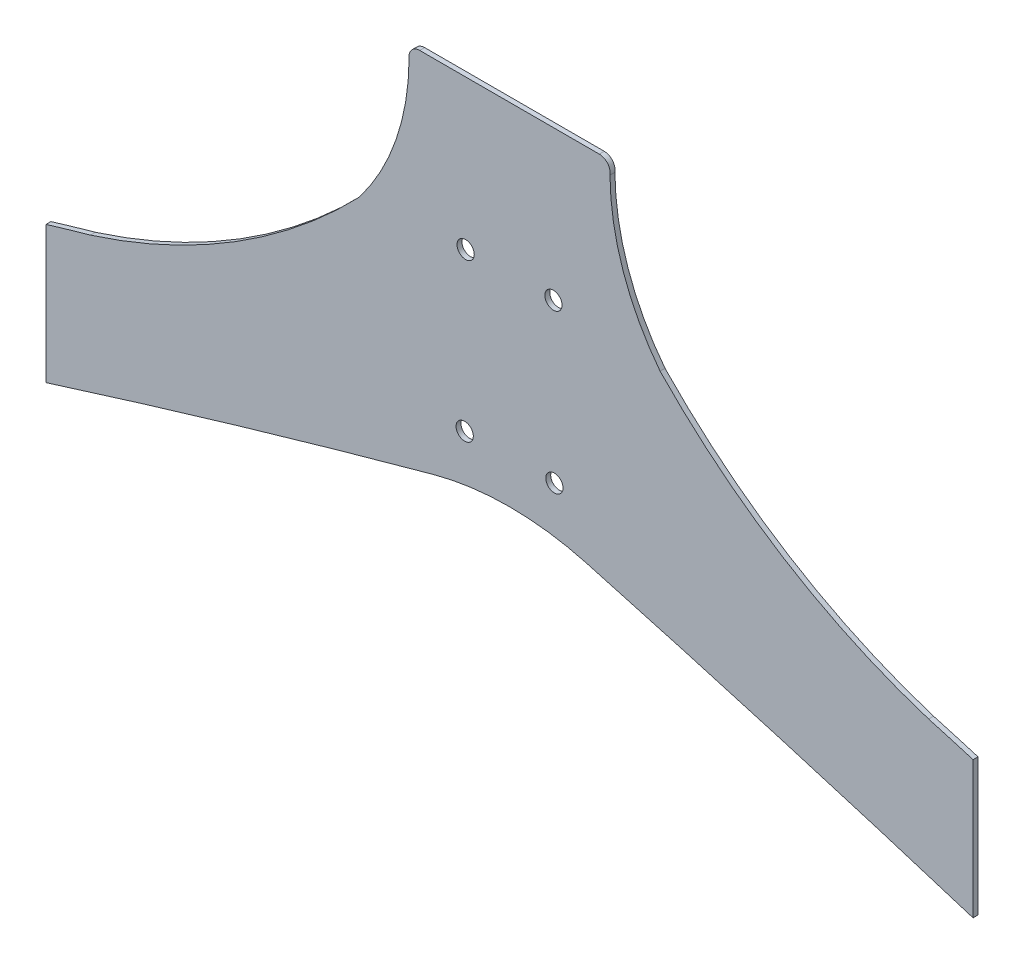
ISO-10303-21;
HEADER;
FILE_DESCRIPTION(('STEP AP214'),'2;1');
FILE_NAME('part.step','',(''),(''),'','','');
FILE_SCHEMA(('AUTOMOTIVE_DESIGN { 1 0 10303 214 1 1 1 1 }'));
ENDSEC;
DATA;
#1=APPLICATION_CONTEXT('core data for automotive mechanical design processes');
#2=APPLICATION_PROTOCOL_DEFINITION('international standard','automotive_design',2000,#1);
#3=PRODUCT_CONTEXT('',#1,'mechanical');
#4=PRODUCT('Part','Part','',(#3));
#5=PRODUCT_RELATED_PRODUCT_CATEGORY('part','',(#4));
#6=PRODUCT_DEFINITION_FORMATION('','',#4);
#7=PRODUCT_DEFINITION_CONTEXT('part definition',#1,'design');
#8=PRODUCT_DEFINITION('design','',#6,#7);
#9=PRODUCT_DEFINITION_SHAPE('','',#8);
#10=(LENGTH_UNIT() NAMED_UNIT(*) SI_UNIT(.MILLI.,.METRE.));
#11=(NAMED_UNIT(*) PLANE_ANGLE_UNIT() SI_UNIT($,.RADIAN.));
#12=(NAMED_UNIT(*) SI_UNIT($,.STERADIAN.) SOLID_ANGLE_UNIT());
#13=UNCERTAINTY_MEASURE_WITH_UNIT(LENGTH_MEASURE(1.E-05),#10,'distance_accuracy_value','');
#14=(GEOMETRIC_REPRESENTATION_CONTEXT(3) GLOBAL_UNCERTAINTY_ASSIGNED_CONTEXT((#13)) GLOBAL_UNIT_ASSIGNED_CONTEXT((#10,
#11,#12)) REPRESENTATION_CONTEXT('',''));
#15=CARTESIAN_POINT('',(0.,0.,0.));
#16=DIRECTION('',(0.,0.,1.));
#17=DIRECTION('',(1.,0.,0.));
#18=AXIS2_PLACEMENT_3D('',#15,#16,#17);
#19=CARTESIAN_POINT('',(-596.9,-624.582509856691,0.));
#20=DIRECTION('',(1.,0.,0.));
#21=DIRECTION('',(0.,0.,-1.));
#22=AXIS2_PLACEMENT_3D('',#19,#20,#21);
#23=PLANE('',#22);
#24=DIRECTION('',(0.,1.,0.));
#25=VECTOR('',#24,1.);
#26=CARTESIAN_POINT('',(-596.9,-2169.24955294867,0.));
#27=LINE('',#26,#25);
#28=CARTESIAN_POINT('',(-596.9,767.652698165207,0.));
#29=VERTEX_POINT('',#28);
#30=CARTESIAN_POINT('',(-596.9,944.092786482488,0.));
#31=VERTEX_POINT('',#30);
#32=EDGE_CURVE('E258',#29,#31,#27,.T.);
#33=ORIENTED_EDGE('',*,*,#32,.F.);
#34=DIRECTION('',(0.,0.,-1.));
#35=VECTOR('',#34,1.);
#36=CARTESIAN_POINT('',(-596.9,767.652698165207,6.35));
#37=LINE('',#36,#35);
#38=CARTESIAN_POINT('',(-596.9,767.652698165207,6.35));
#39=VERTEX_POINT('',#38);
#40=EDGE_CURVE('E241',#29,#39,#37,.F.);
#41=ORIENTED_EDGE('',*,*,#40,.T.);
#42=DIRECTION('',(0.,1.,0.));
#43=VECTOR('',#42,1.);
#44=CARTESIAN_POINT('',(-596.9,-2169.24955294867,6.35));
#45=LINE('',#44,#43);
#46=CARTESIAN_POINT('',(-596.9,944.092786482488,6.35));
#47=VERTEX_POINT('',#46);
#48=EDGE_CURVE('E245',#39,#47,#45,.T.);
#49=ORIENTED_EDGE('',*,*,#48,.T.);
#50=DIRECTION('',(0.,0.,-1.));
#51=VECTOR('',#50,1.);
#52=CARTESIAN_POINT('',(-596.9,944.092786482488,6.35));
#53=LINE('',#52,#51);
#54=EDGE_CURVE('E240',#31,#47,#53,.F.);
#55=ORIENTED_EDGE('',*,*,#54,.F.);
#56=EDGE_LOOP('',(#33,#41,#49,#55));
#57=FACE_BOUND('',#56,.T.);
#58=ADVANCED_FACE('F42',(#57),#23,.F.);
#59=CARTESIAN_POINT('',(596.9,-624.582509856691,0.));
#60=DIRECTION('',(-1.,0.,0.));
#61=DIRECTION('',(0.,0.,-1.));
#62=AXIS2_PLACEMENT_3D('',#59,#60,#61);
#63=PLANE('',#62);
#64=DIRECTION('',(0.,-1.,0.));
#65=VECTOR('',#64,1.);
#66=CARTESIAN_POINT('',(596.9,-2169.24955294867,6.35));
#67=LINE('',#66,#65);
#68=CARTESIAN_POINT('',(596.9,944.092786482594,6.35));
#69=VERTEX_POINT('',#68);
#70=CARTESIAN_POINT('',(596.9,767.652698165207,6.35));
#71=VERTEX_POINT('',#70);
#72=EDGE_CURVE('E46',#69,#71,#67,.T.);
#73=ORIENTED_EDGE('',*,*,#72,.T.);
#74=DIRECTION('',(0.,0.,-1.));
#75=VECTOR('',#74,1.);
#76=CARTESIAN_POINT('',(596.9,767.652698165207,6.35));
#77=LINE('',#76,#75);
#78=CARTESIAN_POINT('',(596.9,767.652698165207,0.));
#79=VERTEX_POINT('',#78);
#80=EDGE_CURVE('E242',#71,#79,#77,.T.);
#81=ORIENTED_EDGE('',*,*,#80,.T.);
#82=DIRECTION('',(0.,-1.,0.));
#83=VECTOR('',#82,1.);
#84=CARTESIAN_POINT('',(596.9,-2169.24955294867,0.));
#85=LINE('',#84,#83);
#86=CARTESIAN_POINT('',(596.9,944.092786482594,0.));
#87=VERTEX_POINT('',#86);
#88=EDGE_CURVE('E159',#87,#79,#85,.T.);
#89=ORIENTED_EDGE('',*,*,#88,.F.);
#90=DIRECTION('',(0.,0.,-1.));
#91=VECTOR('',#90,1.);
#92=CARTESIAN_POINT('',(596.9,944.092786482594,6.35));
#93=LINE('',#92,#91);
#94=EDGE_CURVE('E236',#69,#87,#93,.T.);
#95=ORIENTED_EDGE('',*,*,#94,.F.);
#96=EDGE_LOOP('',(#73,#81,#89,#95));
#97=FACE_BOUND('',#96,.T.);
#98=ADVANCED_FACE('F273',(#97),#63,.F.);
#99=CARTESIAN_POINT('',(-56.5321874015803,1186.24739426548,6.35));
#100=DIRECTION('',(0.,0.,-1.));
#101=DIRECTION('',(-1.,0.,0.));
#102=AXIS2_PLACEMENT_3D('',#99,#100,#101);
#103=CYLINDRICAL_SURFACE('',#102,11.1125000000003);
#104=CARTESIAN_POINT('',(-56.5321874015803,1186.24739426548,6.35));
#105=DIRECTION('',(0.,0.,1.));
#106=DIRECTION('',(1.,0.,0.));
#107=AXIS2_PLACEMENT_3D('',#104,#105,#106);
#108=CIRCLE('',#107,11.1125000000003);
#109=CARTESIAN_POINT('',(-45.41968740158,1186.24739426548,6.35));
#110=VERTEX_POINT('',#109);
#111=EDGE_CURVE('E212',#110,#110,#108,.T.);
#112=ORIENTED_EDGE('',*,*,#111,.T.);
#113=EDGE_LOOP('',(#112));
#114=FACE_BOUND('',#113,.T.);
#115=CARTESIAN_POINT('',(-56.5321874015803,1186.24739426548,0.));
#116=DIRECTION('',(0.,0.,1.));
#117=DIRECTION('',(1.,0.,0.));
#118=AXIS2_PLACEMENT_3D('',#115,#116,#117);
#119=CIRCLE('',#118,11.1125000000003);
#120=CARTESIAN_POINT('',(-45.41968740158,1186.24739426548,0.));
#121=VERTEX_POINT('',#120);
#122=EDGE_CURVE('E252',#121,#121,#119,.T.);
#123=ORIENTED_EDGE('',*,*,#122,.F.);
#124=EDGE_LOOP('',(#123));
#125=FACE_BOUND('',#124,.T.);
#126=ADVANCED_FACE('F299',(#114,#125),#103,.F.);
#127=CARTESIAN_POINT('',(-57.7678123690255,983.012939426247,6.35));
#128=DIRECTION('',(0.,0.,-1.));
#129=DIRECTION('',(-1.,0.,0.));
#130=AXIS2_PLACEMENT_3D('',#127,#128,#129);
#131=CYLINDRICAL_SURFACE('',#130,11.1125000000003);
#132=CARTESIAN_POINT('',(-57.7678123690255,983.012939426247,6.35));
#133=DIRECTION('',(0.,0.,1.));
#134=DIRECTION('',(1.,0.,0.));
#135=AXIS2_PLACEMENT_3D('',#132,#133,#134);
#136=CIRCLE('',#135,11.1125000000003);
#137=CARTESIAN_POINT('',(-46.6553123690252,983.012939426247,6.35));
#138=VERTEX_POINT('',#137);
#139=EDGE_CURVE('E215',#138,#138,#136,.T.);
#140=ORIENTED_EDGE('',*,*,#139,.T.);
#141=EDGE_LOOP('',(#140));
#142=FACE_BOUND('',#141,.T.);
#143=CARTESIAN_POINT('',(-57.7678123690255,983.012939426247,0.));
#144=DIRECTION('',(0.,0.,1.));
#145=DIRECTION('',(1.,0.,0.));
#146=AXIS2_PLACEMENT_3D('',#143,#144,#145);
#147=CIRCLE('',#146,11.1125000000003);
#148=CARTESIAN_POINT('',(-46.6553123690252,983.012939426247,0.));
#149=VERTEX_POINT('',#148);
#150=EDGE_CURVE('E369',#149,#149,#147,.T.);
#151=ORIENTED_EDGE('',*,*,#150,.F.);
#152=EDGE_LOOP('',(#151));
#153=FACE_BOUND('',#152,.T.);
#154=ADVANCED_FACE('F386',(#142,#153),#131,.F.);
#155=CARTESIAN_POINT('',(57.7678123690255,983.012939426247,6.35));
#156=DIRECTION('',(0.,0.,-1.));
#157=DIRECTION('',(-1.,0.,0.));
#158=AXIS2_PLACEMENT_3D('',#155,#156,#157);
#159=CYLINDRICAL_SURFACE('',#158,11.1124999999994);
#160=CARTESIAN_POINT('',(57.7678123690255,983.012939426247,6.35));
#161=DIRECTION('',(0.,0.,1.));
#162=DIRECTION('',(1.,0.,0.));
#163=AXIS2_PLACEMENT_3D('',#160,#161,#162);
#164=CIRCLE('',#163,11.1124999999994);
#165=CARTESIAN_POINT('',(68.8803123690249,983.012939426247,6.35));
#166=VERTEX_POINT('',#165);
#167=EDGE_CURVE('E219',#166,#166,#164,.T.);
#168=ORIENTED_EDGE('',*,*,#167,.T.);
#169=EDGE_LOOP('',(#168));
#170=FACE_BOUND('',#169,.T.);
#171=CARTESIAN_POINT('',(57.7678123690255,983.012939426247,0.));
#172=DIRECTION('',(0.,0.,1.));
#173=DIRECTION('',(1.,0.,0.));
#174=AXIS2_PLACEMENT_3D('',#171,#172,#173);
#175=CIRCLE('',#174,11.1124999999994);
#176=CARTESIAN_POINT('',(68.8803123690249,983.012939426247,0.));
#177=VERTEX_POINT('',#176);
#178=EDGE_CURVE('E371',#177,#177,#175,.T.);
#179=ORIENTED_EDGE('',*,*,#178,.F.);
#180=EDGE_LOOP('',(#179));
#181=FACE_BOUND('',#180,.T.);
#182=ADVANCED_FACE('F290',(#170,#181),#159,.F.);
#183=CARTESIAN_POINT('',(56.5321874015812,1186.24739426548,6.35));
#184=DIRECTION('',(0.,0.,-1.));
#185=DIRECTION('',(-1.,0.,0.));
#186=AXIS2_PLACEMENT_3D('',#183,#184,#185);
#187=CYLINDRICAL_SURFACE('',#186,11.1124999999994);
#188=CARTESIAN_POINT('',(56.5321874015812,1186.24739426548,6.35));
#189=DIRECTION('',(0.,0.,1.));
#190=DIRECTION('',(1.,0.,0.));
#191=AXIS2_PLACEMENT_3D('',#188,#189,#190);
#192=CIRCLE('',#191,11.1124999999994);
#193=CARTESIAN_POINT('',(67.6446874015806,1186.24739426548,6.35));
#194=VERTEX_POINT('',#193);
#195=EDGE_CURVE('E222',#194,#194,#192,.T.);
#196=ORIENTED_EDGE('',*,*,#195,.T.);
#197=EDGE_LOOP('',(#196));
#198=FACE_BOUND('',#197,.T.);
#199=CARTESIAN_POINT('',(56.5321874015812,1186.24739426548,0.));
#200=DIRECTION('',(0.,0.,1.));
#201=DIRECTION('',(1.,0.,0.));
#202=AXIS2_PLACEMENT_3D('',#199,#200,#201);
#203=CIRCLE('',#202,11.1124999999994);
#204=CARTESIAN_POINT('',(67.6446874015806,1186.24739426548,0.));
#205=VERTEX_POINT('',#204);
#206=EDGE_CURVE('E164',#205,#205,#203,.T.);
#207=ORIENTED_EDGE('',*,*,#206,.F.);
#208=EDGE_LOOP('',(#207));
#209=FACE_BOUND('',#208,.T.);
#210=ADVANCED_FACE('F283',(#198,#209),#187,.F.);
#211=CARTESIAN_POINT('',(-0.168888734806139,554.271739015872,6.35));
#212=DIRECTION('',(0.,0.,-1.));
#213=DIRECTION('',(-1.,0.,0.));
#214=AXIS2_PLACEMENT_3D('',#211,#212,#213);
#215=CYLINDRICAL_SURFACE('',#214,373.41664877535);
#216=CARTESIAN_POINT('',(-0.168888734806139,554.271739015872,0.));
#217=DIRECTION('',(0.,0.,1.));
#218=DIRECTION('',(1.,0.,0.));
#219=AXIS2_PLACEMENT_3D('',#216,#217,#218);
#220=CIRCLE('',#219,373.41664877535);
#221=CARTESIAN_POINT('',(4.26653341562694E-11,927.688349598755,0.));
#222=VERTEX_POINT('',#221);
#223=CARTESIAN_POINT('',(-98.6021055811159,914.481254997757,0.));
#224=VERTEX_POINT('',#223);
#225=EDGE_CURVE('E53',#222,#224,#220,.T.);
#226=ORIENTED_EDGE('',*,*,#225,.F.);
#227=DIRECTION('',(0.,0.,-1.));
#228=VECTOR('',#227,1.);
#229=CARTESIAN_POINT('',(4.26653341562694E-11,927.688349598755,6.35));
#230=LINE('',#229,#228);
#231=CARTESIAN_POINT('',(4.26653341562694E-11,927.688349598755,6.35));
#232=VERTEX_POINT('',#231);
#233=EDGE_CURVE('E105',#232,#222,#230,.T.);
#234=ORIENTED_EDGE('',*,*,#233,.F.);
#235=CARTESIAN_POINT('',(-0.168888734806139,554.271739015872,6.35));
#236=DIRECTION('',(0.,0.,1.));
#237=DIRECTION('',(1.,0.,0.));
#238=AXIS2_PLACEMENT_3D('',#235,#236,#237);
#239=CIRCLE('',#238,373.41664877535);
#240=CARTESIAN_POINT('',(-98.6021055811159,914.481254997757,6.35));
#241=VERTEX_POINT('',#240);
#242=EDGE_CURVE('E229',#232,#241,#239,.T.);
#243=ORIENTED_EDGE('',*,*,#242,.T.);
#244=DIRECTION('',(0.,0.,-1.));
#245=VECTOR('',#244,1.);
#246=CARTESIAN_POINT('',(-98.6021055811159,914.481254997757,6.35));
#247=LINE('',#246,#245);
#248=EDGE_CURVE('E65',#241,#224,#247,.T.);
#249=ORIENTED_EDGE('',*,*,#248,.T.);
#250=EDGE_LOOP('',(#226,#234,#243,#249));
#251=FACE_BOUND('',#250,.T.);
#252=ADVANCED_FACE('F281',(#251),#215,.F.);
#253=CARTESIAN_POINT('',(0.168888734807027,554.271739015872,6.35));
#254=DIRECTION('',(0.,0.,-1.));
#255=DIRECTION('',(-1.,0.,0.));
#256=AXIS2_PLACEMENT_3D('',#253,#254,#255);
#257=CYLINDRICAL_SURFACE('',#256,373.41664877535);
#258=CARTESIAN_POINT('',(0.168888734807027,554.271739015872,0.));
#259=DIRECTION('',(0.,0.,1.));
#260=DIRECTION('',(1.,0.,0.));
#261=AXIS2_PLACEMENT_3D('',#258,#259,#260);
#262=CIRCLE('',#261,373.41664877535);
#263=CARTESIAN_POINT('',(98.6021055811213,914.481254997755,0.));
#264=VERTEX_POINT('',#263);
#265=EDGE_CURVE('E156',#264,#222,#262,.T.);
#266=ORIENTED_EDGE('',*,*,#265,.F.);
#267=DIRECTION('',(0.,0.,-1.));
#268=VECTOR('',#267,1.);
#269=CARTESIAN_POINT('',(98.6021055811213,914.481254997755,6.35));
#270=LINE('',#269,#268);
#271=CARTESIAN_POINT('',(98.6021055811213,914.481254997755,6.35));
#272=VERTEX_POINT('',#271);
#273=EDGE_CURVE('E167',#272,#264,#270,.T.);
#274=ORIENTED_EDGE('',*,*,#273,.F.);
#275=CARTESIAN_POINT('',(0.168888734807027,554.271739015872,6.35));
#276=DIRECTION('',(0.,0.,1.));
#277=DIRECTION('',(1.,0.,0.));
#278=AXIS2_PLACEMENT_3D('',#275,#276,#277);
#279=CIRCLE('',#278,373.41664877535);
#280=EDGE_CURVE('E226',#272,#232,#279,.T.);
#281=ORIENTED_EDGE('',*,*,#280,.T.);
#282=ORIENTED_EDGE('',*,*,#233,.T.);
#283=EDGE_LOOP('',(#266,#274,#281,#282));
#284=FACE_BOUND('',#283,.T.);
#285=ADVANCED_FACE('F177',(#284),#257,.F.);
#286=CARTESIAN_POINT('',(-3360.15803335572,-11742.6110911019,6.35));
#287=DIRECTION('',(0.,0.,-1.));
#288=DIRECTION('',(-1.,0.,0.));
#289=AXIS2_PLACEMENT_3D('',#286,#287,#288);
#290=CYLINDRICAL_SURFACE('',#289,13121.1664251465);
#291=ORIENTED_EDGE('',*,*,#80,.F.);
#292=CARTESIAN_POINT('',(-3360.15803335572,-11742.6110911019,6.35));
#293=DIRECTION('',(0.,0.,1.));
#294=DIRECTION('',(1.,0.,0.));
#295=AXIS2_PLACEMENT_3D('',#292,#293,#294);
#296=CIRCLE('',#295,13121.1664251465);
#297=EDGE_CURVE('E170',#71,#272,#296,.T.);
#298=ORIENTED_EDGE('',*,*,#297,.T.);
#299=ORIENTED_EDGE('',*,*,#273,.T.);
#300=CARTESIAN_POINT('',(-3360.15803335572,-11742.6110911019,0.));
#301=DIRECTION('',(0.,0.,1.));
#302=DIRECTION('',(1.,0.,0.));
#303=AXIS2_PLACEMENT_3D('',#300,#301,#302);
#304=CIRCLE('',#303,13121.1664251465);
#305=EDGE_CURVE('E150',#79,#264,#304,.T.);
#306=ORIENTED_EDGE('',*,*,#305,.F.);
#307=EDGE_LOOP('',(#291,#298,#299,#306));
#308=FACE_BOUND('',#307,.T.);
#309=ADVANCED_FACE('F168',(#308),#290,.F.);
#310=CARTESIAN_POINT('',(-153.596244838624,-1521.42780684023,6.35));
#311=DIRECTION('',(0.,0.,-1.));
#312=DIRECTION('',(-1.,0.,0.));
#313=AXIS2_PLACEMENT_3D('',#310,#311,#312);
#314=CYLINDRICAL_SURFACE('',#313,2577.21485515194);
#315=CARTESIAN_POINT('',(-153.596244838624,-1521.42780684023,6.35));
#316=DIRECTION('',(0.,0.,1.));
#317=DIRECTION('',(1.,0.,0.));
#318=AXIS2_PLACEMENT_3D('',#315,#316,#317);
#319=CIRCLE('',#318,2577.21485515194);
#320=CARTESIAN_POINT('',(539.656545931496,960.796392885743,6.35));
#321=VERTEX_POINT('',#320);
#322=EDGE_CURVE('E211',#69,#321,#319,.T.);
#323=ORIENTED_EDGE('',*,*,#322,.F.);
#324=ORIENTED_EDGE('',*,*,#94,.T.);
#325=CARTESIAN_POINT('',(-153.596244838624,-1521.42780684023,0.));
#326=DIRECTION('',(0.,0.,1.));
#327=DIRECTION('',(1.,0.,0.));
#328=AXIS2_PLACEMENT_3D('',#325,#326,#327);
#329=CIRCLE('',#328,2577.21485515194);
#330=CARTESIAN_POINT('',(539.656545931496,960.796392885743,0.));
#331=VERTEX_POINT('',#330);
#332=EDGE_CURVE('E250',#87,#331,#329,.T.);
#333=ORIENTED_EDGE('',*,*,#332,.T.);
#334=DIRECTION('',(0.,0.,-1.));
#335=VECTOR('',#334,1.);
#336=CARTESIAN_POINT('',(539.656545931496,960.796392885743,6.35));
#337=LINE('',#336,#335);
#338=EDGE_CURVE('E257',#321,#331,#337,.T.);
#339=ORIENTED_EDGE('',*,*,#338,.F.);
#340=EDGE_LOOP('',(#323,#324,#333,#339));
#341=FACE_BOUND('',#340,.T.);
#342=ADVANCED_FACE('F400',(#341),#314,.T.);
#343=CARTESIAN_POINT('',(789.174664938474,1747.64144806305,6.35));
#344=DIRECTION('',(0.,0.,-1.));
#345=DIRECTION('',(-1.,0.,0.));
#346=AXIS2_PLACEMENT_3D('',#343,#344,#345);
#347=CYLINDRICAL_SURFACE('',#346,825.460133846466);
#348=CARTESIAN_POINT('',(789.174664938474,1747.64144806305,0.));
#349=DIRECTION('',(0.,0.,1.));
#350=DIRECTION('',(1.,0.,0.));
#351=AXIS2_PLACEMENT_3D('',#348,#349,#350);
#352=CIRCLE('',#351,825.460133846466);
#353=CARTESIAN_POINT('',(193.874021231515,1175.80093168466,0.));
#354=VERTEX_POINT('',#353);
#355=EDGE_CURVE('E253',#354,#331,#352,.T.);
#356=ORIENTED_EDGE('',*,*,#355,.F.);
#357=DIRECTION('',(0.,0.,-1.));
#358=VECTOR('',#357,1.);
#359=CARTESIAN_POINT('',(193.874021231515,1175.80093168466,6.35));
#360=LINE('',#359,#358);
#361=CARTESIAN_POINT('',(193.874021231515,1175.80093168466,6.35));
#362=VERTEX_POINT('',#361);
#363=EDGE_CURVE('E328',#362,#354,#360,.T.);
#364=ORIENTED_EDGE('',*,*,#363,.F.);
#365=CARTESIAN_POINT('',(789.174664938474,1747.64144806305,6.35));
#366=DIRECTION('',(0.,0.,1.));
#367=DIRECTION('',(1.,0.,0.));
#368=AXIS2_PLACEMENT_3D('',#365,#366,#367);
#369=CIRCLE('',#368,825.460133846466);
#370=EDGE_CURVE('E207',#362,#321,#369,.T.);
#371=ORIENTED_EDGE('',*,*,#370,.T.);
#372=ORIENTED_EDGE('',*,*,#338,.T.);
#373=EDGE_LOOP('',(#356,#364,#371,#372));
#374=FACE_BOUND('',#373,.T.);
#375=ADVANCED_FACE('F396',(#374),#347,.F.);
#376=CARTESIAN_POINT('',(436.810245749138,1364.2793562186,6.35));
#377=DIRECTION('',(0.,0.,-1.));
#378=DIRECTION('',(-1.,0.,0.));
#379=AXIS2_PLACEMENT_3D('',#376,#377,#378);
#380=CYLINDRICAL_SURFACE('',#379,307.477032797045);
#381=CARTESIAN_POINT('',(436.810245749138,1364.2793562186,0.));
#382=DIRECTION('',(0.,0.,1.));
#383=DIRECTION('',(1.,0.,0.));
#384=AXIS2_PLACEMENT_3D('',#381,#382,#383);
#385=CIRCLE('',#384,307.477032797045);
#386=CARTESIAN_POINT('',(129.340509974583,1362.16103602933,0.));
#387=VERTEX_POINT('',#386);
#388=EDGE_CURVE('E360',#387,#354,#385,.T.);
#389=ORIENTED_EDGE('',*,*,#388,.F.);
#390=DIRECTION('',(0.,0.,-1.));
#391=VECTOR('',#390,1.);
#392=CARTESIAN_POINT('',(129.340509974583,1362.16103602933,6.35));
#393=LINE('',#392,#391);
#394=CARTESIAN_POINT('',(129.340509974583,1362.16103602933,6.35));
#395=VERTEX_POINT('',#394);
#396=EDGE_CURVE('E331',#395,#387,#393,.T.);
#397=ORIENTED_EDGE('',*,*,#396,.F.);
#398=CARTESIAN_POINT('',(436.810245749138,1364.2793562186,6.35));
#399=DIRECTION('',(0.,0.,1.));
#400=DIRECTION('',(1.,0.,0.));
#401=AXIS2_PLACEMENT_3D('',#398,#399,#400);
#402=CIRCLE('',#401,307.477032797045);
#403=EDGE_CURVE('E203',#395,#362,#402,.T.);
#404=ORIENTED_EDGE('',*,*,#403,.T.);
#405=ORIENTED_EDGE('',*,*,#363,.T.);
#406=EDGE_LOOP('',(#389,#397,#404,#405));
#407=FACE_BOUND('',#406,.T.);
#408=ADVANCED_FACE('F399',(#407),#380,.F.);
#409=CARTESIAN_POINT('',(115.577769156483,1364.74453291325,6.35));
#410=DIRECTION('',(0.,0.,-1.));
#411=DIRECTION('',(-1.,0.,0.));
#412=AXIS2_PLACEMENT_3D('',#409,#410,#411);
#413=CYLINDRICAL_SURFACE('',#412,14.0031243290707);
#414=CARTESIAN_POINT('',(115.577769156483,1364.74453291325,0.));
#415=DIRECTION('',(0.,0.,1.));
#416=DIRECTION('',(1.,0.,0.));
#417=AXIS2_PLACEMENT_3D('',#414,#415,#416);
#418=CIRCLE('',#417,14.0031243290707);
#419=CARTESIAN_POINT('',(115.577769156483,1378.74765724232,0.));
#420=VERTEX_POINT('',#419);
#421=EDGE_CURVE('E357',#387,#420,#418,.T.);
#422=ORIENTED_EDGE('',*,*,#421,.T.);
#423=DIRECTION('',(0.,0.,-1.));
#424=VECTOR('',#423,1.);
#425=CARTESIAN_POINT('',(115.577769156483,1378.74765724232,6.35));
#426=LINE('',#425,#424);
#427=CARTESIAN_POINT('',(115.577769156483,1378.74765724232,6.35));
#428=VERTEX_POINT('',#427);
#429=EDGE_CURVE('E333',#428,#420,#426,.T.);
#430=ORIENTED_EDGE('',*,*,#429,.F.);
#431=CARTESIAN_POINT('',(115.577769156483,1364.74453291325,6.35));
#432=DIRECTION('',(0.,0.,1.));
#433=DIRECTION('',(1.,0.,0.));
#434=AXIS2_PLACEMENT_3D('',#431,#432,#433);
#435=CIRCLE('',#434,14.0031243290707);
#436=EDGE_CURVE('E200',#395,#428,#435,.T.);
#437=ORIENTED_EDGE('',*,*,#436,.F.);
#438=ORIENTED_EDGE('',*,*,#396,.T.);
#439=EDGE_LOOP('',(#422,#430,#437,#438));
#440=FACE_BOUND('',#439,.T.);
#441=ADVANCED_FACE('F404',(#440),#413,.T.);
#442=CARTESIAN_POINT('',(-10.0304702538078,1378.74765724235,6.35));
#443=DIRECTION('',(-1.99801735928452E-13,-1.,0.));
#444=DIRECTION('',(1.,-1.99801735928452E-13,0.));
#445=AXIS2_PLACEMENT_3D('',#442,#443,#444);
#446=PLANE('',#445);
#447=DIRECTION('',(-1.,1.99801735928452E-13,0.));
#448=VECTOR('',#447,1.);
#449=CARTESIAN_POINT('',(-10.0304702538078,1378.74765724235,0.));
#450=LINE('',#449,#448);
#451=CARTESIAN_POINT('',(-115.577769156483,1378.74765724232,0.));
#452=VERTEX_POINT('',#451);
#453=EDGE_CURVE('E354',#420,#452,#450,.T.);
#454=ORIENTED_EDGE('',*,*,#453,.T.);
#455=DIRECTION('',(0.,0.,-1.));
#456=VECTOR('',#455,1.);
#457=CARTESIAN_POINT('',(-115.577769156483,1378.74765724232,6.35));
#458=LINE('',#457,#456);
#459=CARTESIAN_POINT('',(-115.577769156483,1378.74765724232,6.35));
#460=VERTEX_POINT('',#459);
#461=EDGE_CURVE('E336',#460,#452,#458,.T.);
#462=ORIENTED_EDGE('',*,*,#461,.F.);
#463=DIRECTION('',(-1.,1.99801735928452E-13,0.));
#464=VECTOR('',#463,1.);
#465=CARTESIAN_POINT('',(-10.0304702538078,1378.74765724235,6.35));
#466=LINE('',#465,#464);
#467=EDGE_CURVE('E197',#428,#460,#466,.T.);
#468=ORIENTED_EDGE('',*,*,#467,.F.);
#469=ORIENTED_EDGE('',*,*,#429,.T.);
#470=EDGE_LOOP('',(#454,#462,#468,#469));
#471=FACE_BOUND('',#470,.T.);
#472=ADVANCED_FACE('F408',(#471),#446,.F.);
#473=CARTESIAN_POINT('',(-115.577769156483,1364.74453291325,6.35));
#474=DIRECTION('',(0.,0.,-1.));
#475=DIRECTION('',(-1.,0.,0.));
#476=AXIS2_PLACEMENT_3D('',#473,#474,#475);
#477=CYLINDRICAL_SURFACE('',#476,14.0031243290707);
#478=CARTESIAN_POINT('',(-115.577769156483,1364.74453291325,0.));
#479=DIRECTION('',(0.,0.,1.));
#480=DIRECTION('',(1.,0.,0.));
#481=AXIS2_PLACEMENT_3D('',#478,#479,#480);
#482=CIRCLE('',#481,14.0031243290707);
#483=CARTESIAN_POINT('',(-129.340509974582,1362.16103602933,0.));
#484=VERTEX_POINT('',#483);
#485=EDGE_CURVE('E351',#452,#484,#482,.T.);
#486=ORIENTED_EDGE('',*,*,#485,.T.);
#487=DIRECTION('',(0.,0.,-1.));
#488=VECTOR('',#487,1.);
#489=CARTESIAN_POINT('',(-129.340509974582,1362.16103602933,6.35));
#490=LINE('',#489,#488);
#491=CARTESIAN_POINT('',(-129.340509974582,1362.16103602933,6.35));
#492=VERTEX_POINT('',#491);
#493=EDGE_CURVE('E339',#492,#484,#490,.T.);
#494=ORIENTED_EDGE('',*,*,#493,.F.);
#495=CARTESIAN_POINT('',(-115.577769156483,1364.74453291325,6.35));
#496=DIRECTION('',(0.,0.,1.));
#497=DIRECTION('',(1.,0.,0.));
#498=AXIS2_PLACEMENT_3D('',#495,#496,#497);
#499=CIRCLE('',#498,14.0031243290707);
#500=EDGE_CURVE('E195',#460,#492,#499,.T.);
#501=ORIENTED_EDGE('',*,*,#500,.F.);
#502=ORIENTED_EDGE('',*,*,#461,.T.);
#503=EDGE_LOOP('',(#486,#494,#501,#502));
#504=FACE_BOUND('',#503,.T.);
#505=ADVANCED_FACE('F412',(#504),#477,.T.);
#506=CARTESIAN_POINT('',(-436.810245749136,1364.2793562186,6.35));
#507=DIRECTION('',(0.,0.,-1.));
#508=DIRECTION('',(-1.,0.,0.));
#509=AXIS2_PLACEMENT_3D('',#506,#507,#508);
#510=CYLINDRICAL_SURFACE('',#509,307.477032797045);
#511=CARTESIAN_POINT('',(-436.810245749136,1364.2793562186,0.));
#512=DIRECTION('',(0.,0.,1.));
#513=DIRECTION('',(1.,0.,0.));
#514=AXIS2_PLACEMENT_3D('',#511,#512,#513);
#515=CIRCLE('',#514,307.477032797045);
#516=CARTESIAN_POINT('',(-193.874021231649,1175.80093168448,0.));
#517=VERTEX_POINT('',#516);
#518=EDGE_CURVE('E348',#517,#484,#515,.T.);
#519=ORIENTED_EDGE('',*,*,#518,.F.);
#520=DIRECTION('',(0.,0.,-1.));
#521=VECTOR('',#520,1.);
#522=CARTESIAN_POINT('',(-193.874021231649,1175.80093168448,6.35));
#523=LINE('',#522,#521);
#524=CARTESIAN_POINT('',(-193.874021231649,1175.80093168448,6.35));
#525=VERTEX_POINT('',#524);
#526=EDGE_CURVE('E341',#525,#517,#523,.T.);
#527=ORIENTED_EDGE('',*,*,#526,.F.);
#528=CARTESIAN_POINT('',(-436.810245749136,1364.2793562186,6.35));
#529=DIRECTION('',(0.,0.,1.));
#530=DIRECTION('',(1.,0.,0.));
#531=AXIS2_PLACEMENT_3D('',#528,#529,#530);
#532=CIRCLE('',#531,307.477032797045);
#533=EDGE_CURVE('E192',#525,#492,#532,.T.);
#534=ORIENTED_EDGE('',*,*,#533,.T.);
#535=ORIENTED_EDGE('',*,*,#493,.T.);
#536=EDGE_LOOP('',(#519,#527,#534,#535));
#537=FACE_BOUND('',#536,.T.);
#538=ADVANCED_FACE('F416',(#537),#510,.F.);
#539=CARTESIAN_POINT('',(-789.174664938473,1747.64144806305,6.35));
#540=DIRECTION('',(0.,0.,-1.));
#541=DIRECTION('',(-1.,0.,0.));
#542=AXIS2_PLACEMENT_3D('',#539,#540,#541);
#543=CYLINDRICAL_SURFACE('',#542,825.460133846489);
#544=CARTESIAN_POINT('',(-789.174664938473,1747.64144806305,0.));
#545=DIRECTION('',(0.,0.,1.));
#546=DIRECTION('',(1.,0.,0.));
#547=AXIS2_PLACEMENT_3D('',#544,#545,#546);
#548=CIRCLE('',#547,825.460133846489);
#549=CARTESIAN_POINT('',(-539.656545931463,960.796392885646,0.));
#550=VERTEX_POINT('',#549);
#551=EDGE_CURVE('E345',#550,#517,#548,.T.);
#552=ORIENTED_EDGE('',*,*,#551,.F.);
#553=DIRECTION('',(0.,0.,-1.));
#554=VECTOR('',#553,1.);
#555=CARTESIAN_POINT('',(-539.656545931463,960.796392885646,6.35));
#556=LINE('',#555,#554);
#557=CARTESIAN_POINT('',(-539.656545931463,960.796392885646,6.35));
#558=VERTEX_POINT('',#557);
#559=EDGE_CURVE('E118',#558,#550,#556,.T.);
#560=ORIENTED_EDGE('',*,*,#559,.F.);
#561=CARTESIAN_POINT('',(-789.174664938473,1747.64144806305,6.35));
#562=DIRECTION('',(0.,0.,1.));
#563=DIRECTION('',(1.,0.,0.));
#564=AXIS2_PLACEMENT_3D('',#561,#562,#563);
#565=CIRCLE('',#564,825.460133846489);
#566=EDGE_CURVE('E189',#558,#525,#565,.T.);
#567=ORIENTED_EDGE('',*,*,#566,.T.);
#568=ORIENTED_EDGE('',*,*,#526,.T.);
#569=EDGE_LOOP('',(#552,#560,#567,#568));
#570=FACE_BOUND('',#569,.T.);
#571=ADVANCED_FACE('F309',(#570),#543,.F.);
#572=CARTESIAN_POINT('',(153.596244838655,-1521.42780684033,6.35));
#573=DIRECTION('',(0.,0.,-1.));
#574=DIRECTION('',(-1.,0.,0.));
#575=AXIS2_PLACEMENT_3D('',#572,#573,#574);
#576=CYLINDRICAL_SURFACE('',#575,2577.21485515194);
#577=CARTESIAN_POINT('',(153.596244838655,-1521.42780684033,0.));
#578=DIRECTION('',(0.,0.,1.));
#579=DIRECTION('',(1.,0.,0.));
#580=AXIS2_PLACEMENT_3D('',#577,#578,#579);
#581=CIRCLE('',#580,2577.21485515194);
#582=EDGE_CURVE('E235',#550,#31,#581,.T.);
#583=ORIENTED_EDGE('',*,*,#582,.T.);
#584=ORIENTED_EDGE('',*,*,#54,.T.);
#585=CARTESIAN_POINT('',(153.596244838655,-1521.42780684033,6.35));
#586=DIRECTION('',(0.,0.,1.));
#587=DIRECTION('',(1.,0.,0.));
#588=AXIS2_PLACEMENT_3D('',#585,#586,#587);
#589=CIRCLE('',#588,2577.21485515194);
#590=EDGE_CURVE('E175',#558,#47,#589,.T.);
#591=ORIENTED_EDGE('',*,*,#590,.F.);
#592=ORIENTED_EDGE('',*,*,#559,.T.);
#593=EDGE_LOOP('',(#583,#584,#591,#592));
#594=FACE_BOUND('',#593,.T.);
#595=ADVANCED_FACE('F304',(#594),#576,.T.);
#596=CARTESIAN_POINT('',(3360.15803335572,-11742.6110911019,6.35));
#597=DIRECTION('',(0.,0.,-1.));
#598=DIRECTION('',(-1.,0.,0.));
#599=AXIS2_PLACEMENT_3D('',#596,#597,#598);
#600=CYLINDRICAL_SURFACE('',#599,13121.1664251465);
#601=ORIENTED_EDGE('',*,*,#40,.F.);
#602=CARTESIAN_POINT('',(3360.15803335572,-11742.6110911019,0.));
#603=DIRECTION('',(0.,0.,1.));
#604=DIRECTION('',(1.,0.,0.));
#605=AXIS2_PLACEMENT_3D('',#602,#603,#604);
#606=CIRCLE('',#605,13121.1664251465);
#607=EDGE_CURVE('E11',#224,#29,#606,.T.);
#608=ORIENTED_EDGE('',*,*,#607,.F.);
#609=ORIENTED_EDGE('',*,*,#248,.F.);
#610=CARTESIAN_POINT('',(3360.15803335572,-11742.6110911019,6.35));
#611=DIRECTION('',(0.,0.,1.));
#612=DIRECTION('',(1.,0.,0.));
#613=AXIS2_PLACEMENT_3D('',#610,#611,#612);
#614=CIRCLE('',#613,13121.1664251465);
#615=EDGE_CURVE('E232',#241,#39,#614,.T.);
#616=ORIENTED_EDGE('',*,*,#615,.T.);
#617=EDGE_LOOP('',(#601,#608,#609,#616));
#618=FACE_BOUND('',#617,.T.);
#619=ADVANCED_FACE('F302',(#618),#600,.F.);
#620=CARTESIAN_POINT('',(-10.0304702545167,-2169.24955294867,0.));
#621=DIRECTION('',(0.,0.,1.));
#622=DIRECTION('',(1.,0.,0.));
#623=AXIS2_PLACEMENT_3D('',#620,#621,#622);
#624=PLANE('',#623);
#625=ORIENTED_EDGE('',*,*,#607,.T.);
#626=ORIENTED_EDGE('',*,*,#32,.T.);
#627=ORIENTED_EDGE('',*,*,#582,.F.);
#628=ORIENTED_EDGE('',*,*,#551,.T.);
#629=ORIENTED_EDGE('',*,*,#518,.T.);
#630=ORIENTED_EDGE('',*,*,#485,.F.);
#631=ORIENTED_EDGE('',*,*,#453,.F.);
#632=ORIENTED_EDGE('',*,*,#421,.F.);
#633=ORIENTED_EDGE('',*,*,#388,.T.);
#634=ORIENTED_EDGE('',*,*,#355,.T.);
#635=ORIENTED_EDGE('',*,*,#332,.F.);
#636=ORIENTED_EDGE('',*,*,#88,.T.);
#637=ORIENTED_EDGE('',*,*,#305,.T.);
#638=ORIENTED_EDGE('',*,*,#265,.T.);
#639=ORIENTED_EDGE('',*,*,#225,.T.);
#640=EDGE_LOOP('',(#625,#626,#627,#628,#629,#630,#631,#632,#633,#634,#635,#636,#637,#638,#639));
#641=FACE_BOUND('',#640,.T.);
#642=ORIENTED_EDGE('',*,*,#206,.T.);
#643=EDGE_LOOP('',(#642));
#644=FACE_BOUND('',#643,.T.);
#645=ORIENTED_EDGE('',*,*,#178,.T.);
#646=EDGE_LOOP('',(#645));
#647=FACE_BOUND('',#646,.T.);
#648=ORIENTED_EDGE('',*,*,#150,.T.);
#649=EDGE_LOOP('',(#648));
#650=FACE_BOUND('',#649,.T.);
#651=ORIENTED_EDGE('',*,*,#122,.T.);
#652=EDGE_LOOP('',(#651));
#653=FACE_BOUND('',#652,.T.);
#654=ADVANCED_FACE('F152',(#641,#644,#647,#650,#653),#624,.F.);
#655=CARTESIAN_POINT('',(-10.0304702545167,-2169.24955294867,6.35));
#656=DIRECTION('',(0.,0.,1.));
#657=DIRECTION('',(1.,0.,0.));
#658=AXIS2_PLACEMENT_3D('',#655,#656,#657);
#659=PLANE('',#658);
#660=ORIENTED_EDGE('',*,*,#48,.F.);
#661=ORIENTED_EDGE('',*,*,#615,.F.);
#662=ORIENTED_EDGE('',*,*,#242,.F.);
#663=ORIENTED_EDGE('',*,*,#280,.F.);
#664=ORIENTED_EDGE('',*,*,#297,.F.);
#665=ORIENTED_EDGE('',*,*,#72,.F.);
#666=ORIENTED_EDGE('',*,*,#322,.T.);
#667=ORIENTED_EDGE('',*,*,#370,.F.);
#668=ORIENTED_EDGE('',*,*,#403,.F.);
#669=ORIENTED_EDGE('',*,*,#436,.T.);
#670=ORIENTED_EDGE('',*,*,#467,.T.);
#671=ORIENTED_EDGE('',*,*,#500,.T.);
#672=ORIENTED_EDGE('',*,*,#533,.F.);
#673=ORIENTED_EDGE('',*,*,#566,.F.);
#674=ORIENTED_EDGE('',*,*,#590,.T.);
#675=EDGE_LOOP('',(#660,#661,#662,#663,#664,#665,#666,#667,#668,#669,#670,#671,#672,#673,#674));
#676=FACE_BOUND('',#675,.T.);
#677=ORIENTED_EDGE('',*,*,#195,.F.);
#678=EDGE_LOOP('',(#677));
#679=FACE_BOUND('',#678,.T.);
#680=ORIENTED_EDGE('',*,*,#167,.F.);
#681=EDGE_LOOP('',(#680));
#682=FACE_BOUND('',#681,.T.);
#683=ORIENTED_EDGE('',*,*,#139,.F.);
#684=EDGE_LOOP('',(#683));
#685=FACE_BOUND('',#684,.T.);
#686=ORIENTED_EDGE('',*,*,#111,.F.);
#687=EDGE_LOOP('',(#686));
#688=FACE_BOUND('',#687,.T.);
#689=ADVANCED_FACE('F44',(#676,#679,#682,#685,#688),#659,.T.);
#690=CLOSED_SHELL('',(#58,#98,#126,#154,#182,#210,#252,#285,#309,#342,#375,#408,#441,#472,#505,
#538,#571,#595,#619,#654,#689));
#691=MANIFOLD_SOLID_BREP('B2',#690);
#692=ADVANCED_BREP_SHAPE_REPRESENTATION('',(#18,#691),#14);
#693=SHAPE_DEFINITION_REPRESENTATION(#9,#692);
ENDSEC;
END-ISO-10303-21;
